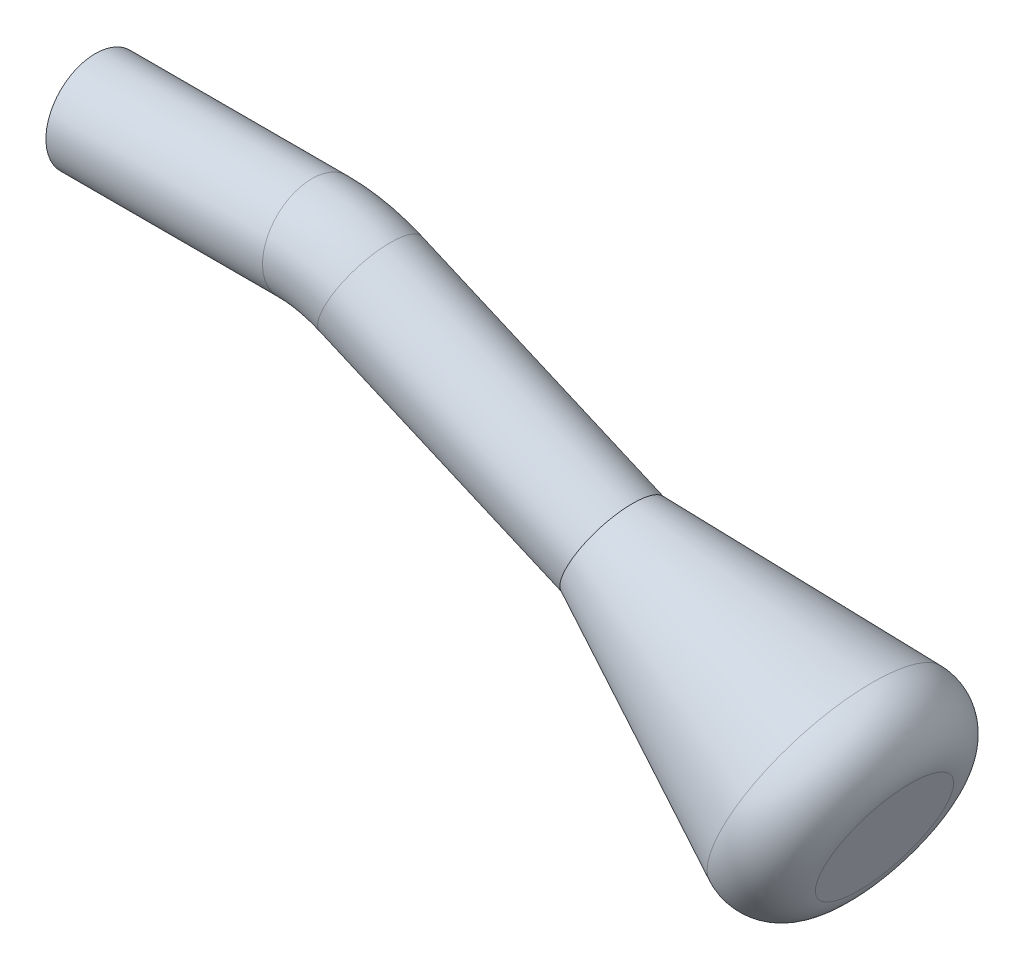
ISO-10303-21;
HEADER;
FILE_DESCRIPTION(('STEP AP214'),'2;1');
FILE_NAME('part.step','',(''),(''),'','','');
FILE_SCHEMA(('AUTOMOTIVE_DESIGN { 1 0 10303 214 1 1 1 1 }'));
ENDSEC;
DATA;
#1=APPLICATION_CONTEXT('core data for automotive mechanical design processes');
#2=APPLICATION_PROTOCOL_DEFINITION('international standard','automotive_design',2000,#1);
#3=PRODUCT_CONTEXT('',#1,'mechanical');
#4=PRODUCT('Part','Part','',(#3));
#5=PRODUCT_RELATED_PRODUCT_CATEGORY('part','',(#4));
#6=PRODUCT_DEFINITION_FORMATION('','',#4);
#7=PRODUCT_DEFINITION_CONTEXT('part definition',#1,'design');
#8=PRODUCT_DEFINITION('design','',#6,#7);
#9=PRODUCT_DEFINITION_SHAPE('','',#8);
#10=(LENGTH_UNIT() NAMED_UNIT(*) SI_UNIT(.MILLI.,.METRE.));
#11=(NAMED_UNIT(*) PLANE_ANGLE_UNIT() SI_UNIT($,.RADIAN.));
#12=(NAMED_UNIT(*) SI_UNIT($,.STERADIAN.) SOLID_ANGLE_UNIT());
#13=UNCERTAINTY_MEASURE_WITH_UNIT(LENGTH_MEASURE(1.E-05),#10,'distance_accuracy_value','');
#14=(GEOMETRIC_REPRESENTATION_CONTEXT(3) GLOBAL_UNCERTAINTY_ASSIGNED_CONTEXT((#13)) GLOBAL_UNIT_ASSIGNED_CONTEXT((#10,
#11,#12)) REPRESENTATION_CONTEXT('',''));
#15=CARTESIAN_POINT('',(0.,0.,0.));
#16=DIRECTION('',(0.,0.,1.));
#17=DIRECTION('',(1.,0.,0.));
#18=AXIS2_PLACEMENT_3D('',#15,#16,#17);
#19=CARTESIAN_POINT('',(52.4667625745869,-11.8563756862423,0.));
#20=DIRECTION('',(0.917774580847103,-0.397101773794735,0.));
#21=DIRECTION('',(0.397101773794735,0.917774580847103,0.));
#22=AXIS2_PLACEMENT_3D('',#19,#20,#21);
#23=CONICAL_SURFACE('',#22,5.,0.26179938779915);
#24=CARTESIAN_POINT('',(74.2234393925934,-21.2700325216004,0.));
#25=DIRECTION('',(0.917774580847103,-0.397101773794735,0.));
#26=DIRECTION('',(0.397101773794735,0.917774580847103,0.));
#27=AXIS2_PLACEMENT_3D('',#24,#25,#26);
#28=CIRCLE('',#27,11.351978040173);
#29=CARTESIAN_POINT('',(78.731330008425,-10.8514756339951,0.));
#30=VERTEX_POINT('',#29);
#31=EDGE_CURVE('E11',#30,#30,#28,.F.);
#32=ORIENTED_EDGE('',*,*,#31,.T.);
#33=EDGE_LOOP('',(#32));
#34=FACE_BOUND('',#33,.T.);
#35=CARTESIAN_POINT('',(52.4667625745869,-11.8563756862423,0.));
#36=DIRECTION('',(0.917774580847103,-0.397101773794735,0.));
#37=DIRECTION('',(0.397101773794735,0.917774580847103,0.));
#38=AXIS2_PLACEMENT_3D('',#35,#36,#37);
#39=CIRCLE('',#38,5.);
#40=CARTESIAN_POINT('',(54.4522714435606,-7.26750278200681,0.));
#41=VERTEX_POINT('',#40);
#42=EDGE_CURVE('E64',#41,#41,#39,.T.);
#43=ORIENTED_EDGE('',*,*,#42,.T.);
#44=EDGE_LOOP('',(#43));
#45=FACE_BOUND('',#44,.T.);
#46=ADVANCED_FACE('F49',(#34,#45),#23,.T.);
#47=CARTESIAN_POINT('',(80.,-23.7694289000844,0.));
#48=DIRECTION('',(0.917774580847103,-0.397101773794735,0.));
#49=DIRECTION('',(0.397101773794735,0.917774580847103,0.));
#50=AXIS2_PLACEMENT_3D('',#47,#48,#49);
#51=PLANE('',#50);
#52=CARTESIAN_POINT('',(80.,-23.7694289000844,0.));
#53=DIRECTION('',(0.917774580847103,-0.397101773794735,0.));
#54=DIRECTION('',(0.397101773794735,0.917774580847103,0.));
#55=AXIS2_PLACEMENT_3D('',#52,#53,#54);
#56=CIRCLE('',#55,6.52234890872767);
#57=CARTESIAN_POINT('',(82.5900363209639,-17.7833828642383,0.));
#58=VERTEX_POINT('',#57);
#59=EDGE_CURVE('E57',#58,#58,#56,.T.);
#60=ORIENTED_EDGE('',*,*,#59,.T.);
#61=EDGE_LOOP('',(#60));
#62=FACE_BOUND('',#61,.T.);
#63=ADVANCED_FACE('F92',(#62),#51,.T.);
#64=CARTESIAN_POINT('',(52.4667625745869,-11.8563756862423,0.));
#65=DIRECTION('',(0.917774580847103,-0.397101773794735,0.));
#66=DIRECTION('',(0.397101773794735,0.917774580847103,0.));
#67=AXIS2_PLACEMENT_3D('',#64,#65,#66);
#68=PLANE('',#67);
#69=CARTESIAN_POINT('',(52.4667625745869,-11.8563756862423,0.));
#70=DIRECTION('',(-0.917774580847103,0.397101773794736,0.));
#71=DIRECTION('',(-0.397101773794736,-0.917774580847103,0.));
#72=AXIS2_PLACEMENT_3D('',#69,#70,#71);
#73=CIRCLE('',#72,3.);
#74=CARTESIAN_POINT('',(51.2754572532027,-14.6096994287836,0.));
#75=VERTEX_POINT('',#74);
#76=EDGE_CURVE('E73',#75,#75,#73,.T.);
#77=ORIENTED_EDGE('',*,*,#76,.F.);
#78=EDGE_LOOP('',(#77));
#79=FACE_BOUND('',#78,.T.);
#80=ORIENTED_EDGE('',*,*,#42,.F.);
#81=EDGE_LOOP('',(#80));
#82=FACE_BOUND('',#81,.T.);
#83=ADVANCED_FACE('F89',(#79,#82),#68,.F.);
#84=CARTESIAN_POINT('',(75.4111270957645,-21.7839200311107,0.));
#85=DIRECTION('',(0.917774580847103,-0.397101773794735,0.));
#86=DIRECTION('',(0.397101773794735,0.917774580847103,0.));
#87=AXIS2_PLACEMENT_3D('',#84,#85,#86);
#88=TOROIDAL_SURFACE('',#87,6.52234890872767,5.);
#89=ORIENTED_EDGE('',*,*,#31,.F.);
#90=EDGE_LOOP('',(#89));
#91=FACE_BOUND('',#90,.T.);
#92=ORIENTED_EDGE('',*,*,#59,.F.);
#93=EDGE_LOOP('',(#92));
#94=FACE_BOUND('',#93,.T.);
#95=ADVANCED_FACE('F51',(#91,#94),#88,.T.);
#96=CARTESIAN_POINT('',(72.6578033532232,-20.5926147097265,0.));
#97=DIRECTION('',(-0.917774580847103,0.397101773794736,0.));
#98=DIRECTION('',(-0.397101773794736,-0.917774580847103,0.));
#99=AXIS2_PLACEMENT_3D('',#96,#97,#98);
#100=CYLINDRICAL_SURFACE('',#99,3.);
#101=CARTESIAN_POINT('',(72.6578033532232,-20.5926147097265,0.));
#102=DIRECTION('',(-0.917774580847103,0.397101773794736,0.));
#103=DIRECTION('',(-0.397101773794736,-0.917774580847103,0.));
#104=AXIS2_PLACEMENT_3D('',#101,#102,#103);
#105=CIRCLE('',#104,3.);
#106=CARTESIAN_POINT('',(71.466498031839,-23.3459384522678,0.));
#107=VERTEX_POINT('',#106);
#108=EDGE_CURVE('E70',#107,#107,#105,.T.);
#109=ORIENTED_EDGE('',*,*,#108,.F.);
#110=EDGE_LOOP('',(#109));
#111=FACE_BOUND('',#110,.T.);
#112=ORIENTED_EDGE('',*,*,#76,.T.);
#113=EDGE_LOOP('',(#112));
#114=FACE_BOUND('',#113,.T.);
#115=ADVANCED_FACE('F83',(#111,#114),#100,.F.);
#116=CARTESIAN_POINT('',(72.6578033532232,-20.5926147097265,0.));
#117=DIRECTION('',(-0.917774580847103,0.397101773794736,0.));
#118=DIRECTION('',(-0.397101773794736,-0.917774580847103,0.));
#119=AXIS2_PLACEMENT_3D('',#116,#117,#118);
#120=PLANE('',#119);
#121=ORIENTED_EDGE('',*,*,#108,.T.);
#122=EDGE_LOOP('',(#121));
#123=FACE_BOUND('',#122,.T.);
#124=ADVANCED_FACE('F81',(#123),#120,.T.);
#125=CLOSED_SHELL('',(#46,#63,#83,#95,#115,#124));
#126=MANIFOLD_SOLID_BREP('B2',#125);
#127=CARTESIAN_POINT('',(83.3448286705937,-25.2166659731642,0.));
#128=DIRECTION('',(-0.917774580847102,0.397101773794735,0.));
#129=DIRECTION('',(-0.397101773794735,-0.917774580847103,0.));
#130=AXIS2_PLACEMENT_3D('',#127,#128,#129);
#131=CYLINDRICAL_SURFACE('',#130,3.);
#132=CARTESIAN_POINT('',(52.4667625745869,-11.8563756862423,0.));
#133=DIRECTION('',(0.917774580847103,-0.397101773794735,0.));
#134=DIRECTION('',(0.397101773794735,0.917774580847103,0.));
#135=AXIS2_PLACEMENT_3D('',#132,#133,#134);
#136=CIRCLE('',#135,3.);
#137=CARTESIAN_POINT('',(51.2754572532027,-14.6096994287836,0.));
#138=VERTEX_POINT('',#137);
#139=EDGE_CURVE('E165',#138,#138,#136,.T.);
#140=CARTESIAN_POINT('',(70.822254191529,-19.798411162137,0.));
#141=DIRECTION('',(0.917774580847103,-0.397101773794735,0.));
#142=DIRECTION('',(0.397101773794735,0.917774580847103,0.));
#143=AXIS2_PLACEMENT_3D('',#140,#141,#142);
#144=CIRCLE('',#143,2.99999999999999);
#145=CARTESIAN_POINT('',(69.6309488701448,-22.5517349046783,0.));
#146=VERTEX_POINT('',#145);
#147=EDGE_CURVE('E169',#146,#146,#144,.T.);
#148=CARTESIAN_POINT('',(51.2754572532027,-14.6096994287836,0.));
#149=CARTESIAN_POINT('',(51.4666602908792,-14.6924289649909,0.));
#150=CARTESIAN_POINT('',(51.6578633285557,-14.7751585011981,0.));
#151=CARTESIAN_POINT('',(52.0402694039086,-14.9406175736126,0.));
#152=CARTESIAN_POINT('',(52.2314724415851,-15.0233471098198,0.));
#153=CARTESIAN_POINT('',(52.6138785169381,-15.1888061822343,0.));
#154=CARTESIAN_POINT('',(52.8050815546145,-15.2715357184415,0.));
#155=CARTESIAN_POINT('',(53.1874876299675,-15.436994790856,0.));
#156=CARTESIAN_POINT('',(53.378690667644,-15.5197243270632,0.));
#157=CARTESIAN_POINT('',(53.7610967429969,-15.6851833994777,0.));
#158=CARTESIAN_POINT('',(53.9522997806734,-15.7679129356849,0.));
#159=CARTESIAN_POINT('',(54.3347058560264,-15.9333720080994,0.));
#160=CARTESIAN_POINT('',(54.5259088937029,-16.0161015443067,0.));
#161=CARTESIAN_POINT('',(54.9083149690558,-16.1815606167211,0.));
#162=CARTESIAN_POINT('',(55.0995180067323,-16.2642901529284,0.));
#163=CARTESIAN_POINT('',(55.4819240820853,-16.4297492253428,0.));
#164=CARTESIAN_POINT('',(55.6731271197618,-16.5124787615501,0.));
#165=CARTESIAN_POINT('',(56.0555331951147,-16.6779378339645,0.));
#166=CARTESIAN_POINT('',(56.2467362327912,-16.7606673701718,0.));
#167=CARTESIAN_POINT('',(56.6291423081441,-16.9261264425862,0.));
#168=CARTESIAN_POINT('',(56.8203453458206,-17.0088559787935,0.));
#169=CARTESIAN_POINT('',(57.2027514211736,-17.174315051208,0.));
#170=CARTESIAN_POINT('',(57.3939544588501,-17.2570445874152,0.));
#171=CARTESIAN_POINT('',(57.776360534203,-17.4225036598297,0.));
#172=CARTESIAN_POINT('',(57.9675635718795,-17.5052331960369,0.));
#173=CARTESIAN_POINT('',(58.3499696472325,-17.6706922684514,0.));
#174=CARTESIAN_POINT('',(58.5411726849089,-17.7534218046586,0.));
#175=CARTESIAN_POINT('',(58.9235787602619,-17.9188808770731,0.));
#176=CARTESIAN_POINT('',(59.1147817979384,-18.0016104132803,0.));
#177=CARTESIAN_POINT('',(59.4971878732913,-18.1670694856948,0.));
#178=CARTESIAN_POINT('',(59.6883909109678,-18.249799021902,0.));
#179=CARTESIAN_POINT('',(60.0707969863208,-18.4152580943165,0.));
#180=CARTESIAN_POINT('',(60.2620000239973,-18.4979876305237,0.));
#181=CARTESIAN_POINT('',(60.6444060993502,-18.6634467029382,0.));
#182=CARTESIAN_POINT('',(60.8356091370267,-18.7461762391455,0.));
#183=CARTESIAN_POINT('',(61.2180152123797,-18.9116353115599,0.));
#184=CARTESIAN_POINT('',(61.4092182500561,-18.9943648477672,0.));
#185=CARTESIAN_POINT('',(61.7916243254091,-19.1598239201816,0.));
#186=CARTESIAN_POINT('',(61.9828273630856,-19.2425534563889,0.));
#187=CARTESIAN_POINT('',(62.3652334384385,-19.4080125288033,0.));
#188=CARTESIAN_POINT('',(62.556436476115,-19.4907420650106,0.));
#189=CARTESIAN_POINT('',(62.938842551468,-19.6562011374251,0.));
#190=CARTESIAN_POINT('',(63.1300455891445,-19.7389306736323,0.));
#191=CARTESIAN_POINT('',(63.5124516644974,-19.9043897460468,0.));
#192=CARTESIAN_POINT('',(63.7036547021739,-19.987119282254,0.));
#193=CARTESIAN_POINT('',(64.0860607775269,-20.1525783546685,0.));
#194=CARTESIAN_POINT('',(64.2772638152033,-20.2353078908757,0.));
#195=CARTESIAN_POINT('',(64.6596698905563,-20.4007669632902,0.));
#196=CARTESIAN_POINT('',(64.8508729282328,-20.4834964994974,0.));
#197=CARTESIAN_POINT('',(65.2332790035857,-20.6489555719119,0.));
#198=CARTESIAN_POINT('',(65.4244820412622,-20.7316851081191,0.));
#199=CARTESIAN_POINT('',(65.8068881166152,-20.8971441805336,0.));
#200=CARTESIAN_POINT('',(65.9980911542917,-20.9798737167408,0.));
#201=CARTESIAN_POINT('',(66.3804972296446,-21.1453327891553,0.));
#202=CARTESIAN_POINT('',(66.5717002673211,-21.2280623253626,0.));
#203=CARTESIAN_POINT('',(66.9541063426741,-21.393521397777,0.));
#204=CARTESIAN_POINT('',(67.1453093803505,-21.4762509339843,0.));
#205=CARTESIAN_POINT('',(67.5277154557035,-21.6417100063987,0.));
#206=CARTESIAN_POINT('',(67.71891849338,-21.724439542606,0.));
#207=CARTESIAN_POINT('',(68.1013245687329,-21.8898986150204,0.));
#208=CARTESIAN_POINT('',(68.2925276064094,-21.9726281512277,0.));
#209=CARTESIAN_POINT('',(68.6749336817624,-22.1380872236422,0.));
#210=CARTESIAN_POINT('',(68.8661367194389,-22.2208167598494,0.));
#211=CARTESIAN_POINT('',(69.2485427947918,-22.3862758322639,0.));
#212=CARTESIAN_POINT('',(69.4397458324683,-22.4690053684711,0.));
#213=CARTESIAN_POINT('',(69.6309488701448,-22.5517349046783,0.));
#214=B_SPLINE_CURVE_WITH_KNOTS('',3,(#148,#149,#150,#151,#152,#153,#154,#155,#156,#157,#158,
#159,#160,#161,#162,#163,#164,#165,#166,#167,#168,#169,#170,#171,#172,#173,#174,#175,#176,#177,
#178,#179,#180,#181,#182,#183,#184,#185,#186,#187,#188,#189,#190,#191,#192,#193,#194,#195,#196,
#197,#198,#199,#200,#201,#202,#203,#204,#205,#206,#207,#208,#209,#210,#211,#212,#213),
.UNSPECIFIED.,.F.,.F.,(4,2,2,2,2,2,2,2,2,2,2,2,2,2,2,2,2,2,2,2,2,2,2,2,2,2,2,2,2,2,2,2,4),(0.,
0.625000000000003,1.25,1.875,2.5,3.125,3.75,4.375,5.00000000000001,5.625,6.25,6.875,
7.50000000000001,8.125,8.75,9.37500000000001,10.,10.625,11.25,11.875,12.5,13.125,13.75,14.375,
15.,15.625,16.25,16.875,17.5,18.125,18.75,19.375,20.),.UNSPECIFIED.);
#215=EDGE_CURVE('BSEAM144',#138,#146,#214,.T.);
#216=ORIENTED_EDGE('',*,*,#139,.T.);
#217=ORIENTED_EDGE('',*,*,#147,.F.);
#218=ORIENTED_EDGE('',*,*,#215,.T.);
#219=ORIENTED_EDGE('',*,*,#215,.F.);
#220=EDGE_LOOP('',(#216,#218,#217,#219));
#221=FACE_BOUND('',#220,.T.);
#222=ADVANCED_FACE('F144',(#221),#131,.T.);
#223=CARTESIAN_POINT('',(27.915086215478,-1.23338128729346,0.));
#224=DIRECTION('',(0.917774580847103,-0.397101773794735,0.));
#225=DIRECTION('',(0.397101773794735,0.917774580847103,0.));
#226=AXIS2_PLACEMENT_3D('',#223,#224,#225);
#227=CYLINDRICAL_SURFACE('',#226,5.);
#228=CARTESIAN_POINT('',(27.915086215478,-1.23338128729346,0.));
#229=DIRECTION('',(0.917774580847103,-0.397101773794734,0.));
#230=DIRECTION('',(0.,0.,-1.));
#231=AXIS2_PLACEMENT_3D('',#228,#229,#230);
#232=CIRCLE('',#231,5.);
#233=CARTESIAN_POINT('',(29.9005950844517,3.35549161694206,0.));
#234=VERTEX_POINT('',#233);
#235=EDGE_CURVE('E48',#234,#234,#232,.T.);
#236=ORIENTED_EDGE('',*,*,#235,.T.);
#237=EDGE_LOOP('',(#236));
#238=FACE_BOUND('',#237,.T.);
#239=CARTESIAN_POINT('',(52.4667625745869,-11.8563756862423,0.));
#240=DIRECTION('',(0.917774580847103,-0.397101773794735,0.));
#241=DIRECTION('',(0.397101773794735,0.917774580847103,0.));
#242=AXIS2_PLACEMENT_3D('',#239,#240,#241);
#243=CIRCLE('',#242,5.);
#244=CARTESIAN_POINT('',(54.4522714435606,-7.26750278200681,0.));
#245=VERTEX_POINT('',#244);
#246=EDGE_CURVE('E148',#245,#245,#243,.F.);
#247=ORIENTED_EDGE('',*,*,#246,.T.);
#248=EDGE_LOOP('',(#247));
#249=FACE_BOUND('',#248,.T.);
#250=ADVANCED_FACE('F179',(#238,#249),#227,.T.);
#251=CARTESIAN_POINT('',(0.,0.,0.));
#252=DIRECTION('',(1.,0.,0.));
#253=DIRECTION('',(0.,0.,-1.));
#254=AXIS2_PLACEMENT_3D('',#251,#252,#253);
#255=PLANE('',#254);
#256=CARTESIAN_POINT('',(0.,0.,0.));
#257=DIRECTION('',(1.,0.,0.));
#258=DIRECTION('',(0.,0.,-1.));
#259=AXIS2_PLACEMENT_3D('',#256,#257,#258);
#260=CIRCLE('',#259,5.);
#261=CARTESIAN_POINT('',(0.,0.,-5.));
#262=VERTEX_POINT('',#261);
#263=EDGE_CURVE('E159',#262,#262,#260,.T.);
#264=ORIENTED_EDGE('',*,*,#263,.F.);
#265=EDGE_LOOP('',(#264));
#266=FACE_BOUND('',#265,.T.);
#267=ADVANCED_FACE('F146',(#266),#255,.F.);
#268=CARTESIAN_POINT('',(0.,0.,0.));
#269=DIRECTION('',(1.,0.,0.));
#270=DIRECTION('',(0.,0.,-1.));
#271=AXIS2_PLACEMENT_3D('',#268,#269,#270);
#272=CYLINDRICAL_SURFACE('',#271,5.);
#273=CARTESIAN_POINT('',(21.9585596085569,0.,0.));
#274=DIRECTION('',(1.,0.,0.));
#275=DIRECTION('',(0.,0.,-1.));
#276=AXIS2_PLACEMENT_3D('',#273,#274,#275);
#277=CIRCLE('',#276,5.);
#278=CARTESIAN_POINT('',(21.9585596085568,5.,0.));
#279=VERTEX_POINT('',#278);
#280=EDGE_CURVE('E153',#279,#279,#277,.T.);
#281=ORIENTED_EDGE('',*,*,#280,.F.);
#282=EDGE_LOOP('',(#281));
#283=FACE_BOUND('',#282,.T.);
#284=ORIENTED_EDGE('',*,*,#263,.T.);
#285=EDGE_LOOP('',(#284));
#286=FACE_BOUND('',#285,.T.);
#287=ADVANCED_FACE('F192',(#283,#286),#272,.T.);
#288=CARTESIAN_POINT('',(21.958559608557,-15.,0.));
#289=DIRECTION('',(0.,0.,-1.));
#290=DIRECTION('',(-1.,0.,0.));
#291=AXIS2_PLACEMENT_3D('',#288,#289,#290);
#292=TOROIDAL_SURFACE('',#291,15.,5.);
#293=CARTESIAN_POINT('',(21.958559608557,-15.,0.));
#294=DIRECTION('',(0.,0.,-1.));
#295=DIRECTION('',(-1.,0.,0.));
#296=AXIS2_PLACEMENT_3D('',#293,#294,#295);
#297=CIRCLE('',#296,20.);
#298=EDGE_CURVE('',#279,#234,#297,.T.);
#299=ORIENTED_EDGE('',*,*,#280,.T.);
#300=ORIENTED_EDGE('',*,*,#235,.F.);
#301=ORIENTED_EDGE('',*,*,#298,.T.);
#302=ORIENTED_EDGE('',*,*,#298,.F.);
#303=EDGE_LOOP('',(#299,#301,#300,#302));
#304=FACE_BOUND('',#303,.T.);
#305=ADVANCED_FACE('F185',(#304),#292,.T.);
#306=CARTESIAN_POINT('',(50.7220178679451,-15.8887987261131,0.));
#307=DIRECTION('',(0.917774580847103,-0.397101773794735,0.));
#308=DIRECTION('',(0.397101773794735,0.917774580847103,0.));
#309=AXIS2_PLACEMENT_3D('',#306,#307,#308);
#310=PLANE('',#309);
#311=ORIENTED_EDGE('',*,*,#246,.F.);
#312=EDGE_LOOP('',(#311));
#313=FACE_BOUND('',#312,.T.);
#314=ORIENTED_EDGE('',*,*,#139,.F.);
#315=EDGE_LOOP('',(#314));
#316=FACE_BOUND('',#315,.T.);
#317=ADVANCED_FACE('F188',(#313,#316),#310,.T.);
#318=CARTESIAN_POINT('',(70.822254191529,-19.798411162137,0.));
#319=DIRECTION('',(0.917774580847103,-0.397101773794735,0.));
#320=DIRECTION('',(0.397101773794735,0.917774580847103,0.));
#321=AXIS2_PLACEMENT_3D('',#318,#319,#320);
#322=PLANE('',#321);
#323=ORIENTED_EDGE('',*,*,#147,.T.);
#324=EDGE_LOOP('',(#323));
#325=FACE_BOUND('',#324,.T.);
#326=ADVANCED_FACE('F176',(#325),#322,.T.);
#327=CLOSED_SHELL('',(#222,#250,#267,#287,#305,#317,#326));
#328=MANIFOLD_SOLID_BREP('B6',#327);
#329=ADVANCED_BREP_SHAPE_REPRESENTATION('',(#18,#126,#328),#14);
#330=SHAPE_DEFINITION_REPRESENTATION(#9,#329);
ENDSEC;
END-ISO-10303-21;
